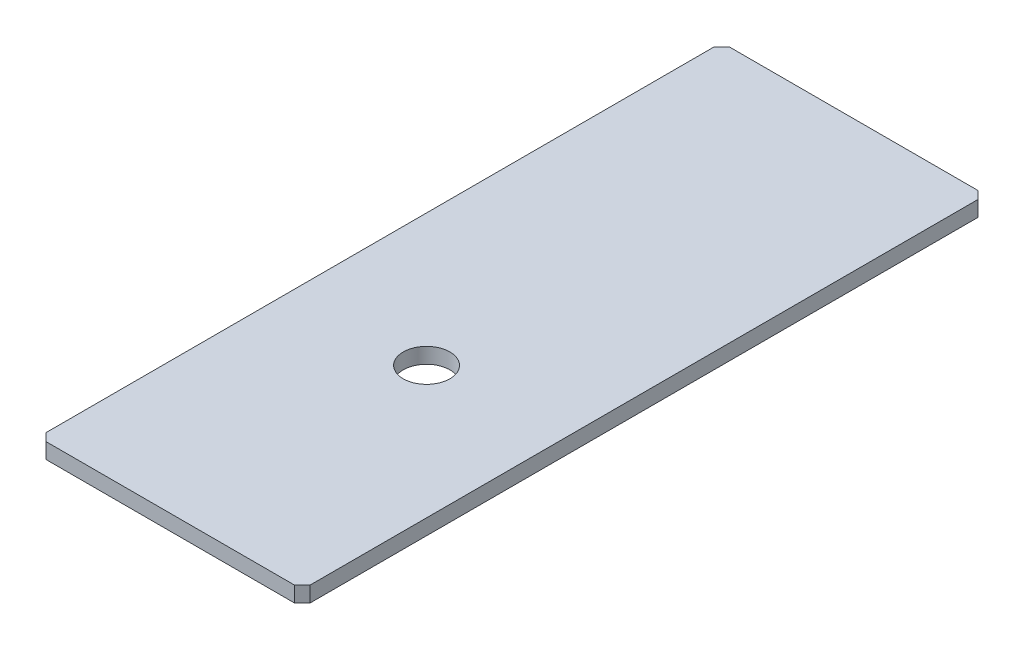
ISO-10303-21;
HEADER;
FILE_DESCRIPTION(('STEP AP214'),'2;1');
FILE_NAME('part.step','',(''),(''),'','','');
FILE_SCHEMA(('AUTOMOTIVE_DESIGN { 1 0 10303 214 1 1 1 1 }'));
ENDSEC;
DATA;
#1=APPLICATION_CONTEXT('core data for automotive mechanical design processes');
#2=APPLICATION_PROTOCOL_DEFINITION('international standard','automotive_design',2000,#1);
#3=PRODUCT_CONTEXT('',#1,'mechanical');
#4=PRODUCT('Part','Part','',(#3));
#5=PRODUCT_RELATED_PRODUCT_CATEGORY('part','',(#4));
#6=PRODUCT_DEFINITION_FORMATION('','',#4);
#7=PRODUCT_DEFINITION_CONTEXT('part definition',#1,'design');
#8=PRODUCT_DEFINITION('design','',#6,#7);
#9=PRODUCT_DEFINITION_SHAPE('','',#8);
#10=(LENGTH_UNIT() NAMED_UNIT(*) SI_UNIT(.MILLI.,.METRE.));
#11=(NAMED_UNIT(*) PLANE_ANGLE_UNIT() SI_UNIT($,.RADIAN.));
#12=(NAMED_UNIT(*) SI_UNIT($,.STERADIAN.) SOLID_ANGLE_UNIT());
#13=UNCERTAINTY_MEASURE_WITH_UNIT(LENGTH_MEASURE(1.E-05),#10,'distance_accuracy_value','');
#14=(GEOMETRIC_REPRESENTATION_CONTEXT(3) GLOBAL_UNCERTAINTY_ASSIGNED_CONTEXT((#13)) GLOBAL_UNIT_ASSIGNED_CONTEXT((#10,
#11,#12)) REPRESENTATION_CONTEXT('',''));
#15=CARTESIAN_POINT('',(0.,0.,0.));
#16=DIRECTION('',(0.,0.,1.));
#17=DIRECTION('',(1.,0.,0.));
#18=AXIS2_PLACEMENT_3D('',#15,#16,#17);
#19=CARTESIAN_POINT('',(0.,1.,0.));
#20=DIRECTION('',(0.,-1.,0.));
#21=DIRECTION('',(0.,0.,-1.));
#22=AXIS2_PLACEMENT_3D('',#19,#20,#21);
#23=PLANE('',#22);
#24=DIRECTION('',(-1.,0.,0.));
#25=VECTOR('',#24,1.);
#26=CARTESIAN_POINT('',(-8.,1.,-22.));
#27=LINE('',#26,#25);
#28=CARTESIAN_POINT('',(8.,1.,-22.));
#29=VERTEX_POINT('',#28);
#30=CARTESIAN_POINT('',(-8.,1.,-22.));
#31=VERTEX_POINT('',#30);
#32=EDGE_CURVE('E145',#29,#31,#27,.T.);
#33=ORIENTED_EDGE('',*,*,#32,.T.);
#34=DIRECTION('',(-0.707106781186547,0.,0.707106781186547));
#35=VECTOR('',#34,1.);
#36=CARTESIAN_POINT('',(-8.5,1.,-21.5));
#37=LINE('',#36,#35);
#38=CARTESIAN_POINT('',(-8.5,1.,-21.5));
#39=VERTEX_POINT('',#38);
#40=EDGE_CURVE('E93',#31,#39,#37,.T.);
#41=ORIENTED_EDGE('',*,*,#40,.T.);
#42=DIRECTION('',(0.,0.,1.));
#43=VECTOR('',#42,1.);
#44=CARTESIAN_POINT('',(-8.5,1.,-21.5));
#45=LINE('',#44,#43);
#46=CARTESIAN_POINT('',(-8.5,1.,21.5));
#47=VERTEX_POINT('',#46);
#48=EDGE_CURVE('E160',#39,#47,#45,.T.);
#49=ORIENTED_EDGE('',*,*,#48,.T.);
#50=DIRECTION('',(0.707106781186547,0.,0.707106781186547));
#51=VECTOR('',#50,1.);
#52=CARTESIAN_POINT('',(-8.5,1.,21.5));
#53=LINE('',#52,#51);
#54=CARTESIAN_POINT('',(-8.,1.,22.));
#55=VERTEX_POINT('',#54);
#56=EDGE_CURVE('E173',#47,#55,#53,.T.);
#57=ORIENTED_EDGE('',*,*,#56,.T.);
#58=DIRECTION('',(1.,0.,0.));
#59=VECTOR('',#58,1.);
#60=CARTESIAN_POINT('',(-8.,1.,22.));
#61=LINE('',#60,#59);
#62=CARTESIAN_POINT('',(8.,1.,22.));
#63=VERTEX_POINT('',#62);
#64=EDGE_CURVE('E112',#55,#63,#61,.T.);
#65=ORIENTED_EDGE('',*,*,#64,.T.);
#66=DIRECTION('',(0.707106781186547,0.,-0.707106781186547));
#67=VECTOR('',#66,1.);
#68=CARTESIAN_POINT('',(8.,1.,22.));
#69=LINE('',#68,#67);
#70=CARTESIAN_POINT('',(8.5,1.,21.5));
#71=VERTEX_POINT('',#70);
#72=EDGE_CURVE('E106',#63,#71,#69,.T.);
#73=ORIENTED_EDGE('',*,*,#72,.T.);
#74=DIRECTION('',(0.,0.,-1.));
#75=VECTOR('',#74,1.);
#76=CARTESIAN_POINT('',(8.5,1.,-21.5));
#77=LINE('',#76,#75);
#78=CARTESIAN_POINT('',(8.5,1.,-21.5));
#79=VERTEX_POINT('',#78);
#80=EDGE_CURVE('E110',#71,#79,#77,.T.);
#81=ORIENTED_EDGE('',*,*,#80,.T.);
#82=DIRECTION('',(-0.707106781186547,0.,-0.707106781186547));
#83=VECTOR('',#82,1.);
#84=CARTESIAN_POINT('',(8.,1.,-22.));
#85=LINE('',#84,#83);
#86=EDGE_CURVE('E50',#79,#29,#85,.T.);
#87=ORIENTED_EDGE('',*,*,#86,.T.);
#88=EDGE_LOOP('',(#33,#41,#49,#57,#65,#73,#81,#87));
#89=FACE_BOUND('',#88,.T.);
#90=CARTESIAN_POINT('',(0.,1.,5.49999999999999));
#91=DIRECTION('',(0.,1.,0.));
#92=DIRECTION('',(0.,0.,1.));
#93=AXIS2_PLACEMENT_3D('',#90,#91,#92);
#94=CIRCLE('',#93,1.5);
#95=CARTESIAN_POINT('',(0.,1.,6.99999999999999));
#96=VERTEX_POINT('',#95);
#97=EDGE_CURVE('E134',#96,#96,#94,.T.);
#98=ORIENTED_EDGE('',*,*,#97,.F.);
#99=EDGE_LOOP('',(#98));
#100=FACE_BOUND('',#99,.T.);
#101=ADVANCED_FACE('F33',(#89,#100),#23,.F.);
#102=CARTESIAN_POINT('',(0.,0.,0.));
#103=DIRECTION('',(0.,-1.,0.));
#104=DIRECTION('',(0.,0.,-1.));
#105=AXIS2_PLACEMENT_3D('',#102,#103,#104);
#106=PLANE('',#105);
#107=DIRECTION('',(-1.,0.,0.));
#108=VECTOR('',#107,1.);
#109=CARTESIAN_POINT('',(-8.,0.,-22.));
#110=LINE('',#109,#108);
#111=CARTESIAN_POINT('',(8.,0.,-22.));
#112=VERTEX_POINT('',#111);
#113=CARTESIAN_POINT('',(-8.,0.,-22.));
#114=VERTEX_POINT('',#113);
#115=EDGE_CURVE('E130',#112,#114,#110,.T.);
#116=ORIENTED_EDGE('',*,*,#115,.F.);
#117=DIRECTION('',(-0.707106781186547,0.,-0.707106781186547));
#118=VECTOR('',#117,1.);
#119=CARTESIAN_POINT('',(8.,0.,-22.));
#120=LINE('',#119,#118);
#121=CARTESIAN_POINT('',(8.5,0.,-21.5));
#122=VERTEX_POINT('',#121);
#123=EDGE_CURVE('E85',#122,#112,#120,.T.);
#124=ORIENTED_EDGE('',*,*,#123,.F.);
#125=DIRECTION('',(0.,0.,-1.));
#126=VECTOR('',#125,1.);
#127=CARTESIAN_POINT('',(8.5,0.,-21.5));
#128=LINE('',#127,#126);
#129=CARTESIAN_POINT('',(8.5,0.,21.5));
#130=VERTEX_POINT('',#129);
#131=EDGE_CURVE('E79',#130,#122,#128,.T.);
#132=ORIENTED_EDGE('',*,*,#131,.F.);
#133=DIRECTION('',(0.707106781186547,0.,-0.707106781186547));
#134=VECTOR('',#133,1.);
#135=CARTESIAN_POINT('',(8.,0.,22.));
#136=LINE('',#135,#134);
#137=CARTESIAN_POINT('',(8.,0.,22.));
#138=VERTEX_POINT('',#137);
#139=EDGE_CURVE('E120',#138,#130,#136,.T.);
#140=ORIENTED_EDGE('',*,*,#139,.F.);
#141=DIRECTION('',(1.,0.,0.));
#142=VECTOR('',#141,1.);
#143=CARTESIAN_POINT('',(-8.,0.,22.));
#144=LINE('',#143,#142);
#145=CARTESIAN_POINT('',(-8.,0.,22.));
#146=VERTEX_POINT('',#145);
#147=EDGE_CURVE('E140',#146,#138,#144,.T.);
#148=ORIENTED_EDGE('',*,*,#147,.F.);
#149=DIRECTION('',(0.707106781186547,0.,0.707106781186547));
#150=VECTOR('',#149,1.);
#151=CARTESIAN_POINT('',(-8.5,0.,21.5));
#152=LINE('',#151,#150);
#153=CARTESIAN_POINT('',(-8.5,0.,21.5));
#154=VERTEX_POINT('',#153);
#155=EDGE_CURVE('E138',#154,#146,#152,.T.);
#156=ORIENTED_EDGE('',*,*,#155,.F.);
#157=DIRECTION('',(0.,0.,1.));
#158=VECTOR('',#157,1.);
#159=CARTESIAN_POINT('',(-8.5,0.,-21.5));
#160=LINE('',#159,#158);
#161=CARTESIAN_POINT('',(-8.5,0.,-21.5));
#162=VERTEX_POINT('',#161);
#163=EDGE_CURVE('E136',#162,#154,#160,.T.);
#164=ORIENTED_EDGE('',*,*,#163,.F.);
#165=DIRECTION('',(-0.707106781186547,0.,0.707106781186547));
#166=VECTOR('',#165,1.);
#167=CARTESIAN_POINT('',(-8.5,0.,-21.5));
#168=LINE('',#167,#166);
#169=EDGE_CURVE('E133',#114,#162,#168,.T.);
#170=ORIENTED_EDGE('',*,*,#169,.F.);
#171=EDGE_LOOP('',(#116,#124,#132,#140,#148,#156,#164,#170));
#172=FACE_BOUND('',#171,.T.);
#173=CARTESIAN_POINT('',(0.,0.,5.49999999999999));
#174=DIRECTION('',(0.,1.,0.));
#175=DIRECTION('',(0.,0.,1.));
#176=AXIS2_PLACEMENT_3D('',#173,#174,#175);
#177=CIRCLE('',#176,1.5);
#178=CARTESIAN_POINT('',(0.,0.,6.99999999999999));
#179=VERTEX_POINT('',#178);
#180=EDGE_CURVE('E179',#179,#179,#177,.T.);
#181=ORIENTED_EDGE('',*,*,#180,.T.);
#182=EDGE_LOOP('',(#181));
#183=FACE_BOUND('',#182,.T.);
#184=ADVANCED_FACE('F164',(#172,#183),#106,.T.);
#185=CARTESIAN_POINT('',(-8.,1.,-22.));
#186=DIRECTION('',(0.,0.,1.));
#187=DIRECTION('',(1.,0.,0.));
#188=AXIS2_PLACEMENT_3D('',#185,#186,#187);
#189=PLANE('',#188);
#190=ORIENTED_EDGE('',*,*,#115,.T.);
#191=DIRECTION('',(0.,-1.,0.));
#192=VECTOR('',#191,1.);
#193=CARTESIAN_POINT('',(-8.,1.,-22.));
#194=LINE('',#193,#192);
#195=EDGE_CURVE('E11',#31,#114,#194,.T.);
#196=ORIENTED_EDGE('',*,*,#195,.F.);
#197=ORIENTED_EDGE('',*,*,#32,.F.);
#198=DIRECTION('',(0.,-1.,0.));
#199=VECTOR('',#198,1.);
#200=CARTESIAN_POINT('',(8.,1.,-22.));
#201=LINE('',#200,#199);
#202=EDGE_CURVE('E126',#29,#112,#201,.T.);
#203=ORIENTED_EDGE('',*,*,#202,.T.);
#204=EDGE_LOOP('',(#190,#196,#197,#203));
#205=FACE_BOUND('',#204,.T.);
#206=ADVANCED_FACE('F35',(#205),#189,.F.);
#207=CARTESIAN_POINT('',(-8.5,1.,-21.5));
#208=DIRECTION('',(0.707106781186547,0.,0.707106781186547));
#209=DIRECTION('',(0.707106781186548,0.,-0.707106781186548));
#210=AXIS2_PLACEMENT_3D('',#207,#208,#209);
#211=PLANE('',#210);
#212=ORIENTED_EDGE('',*,*,#169,.T.);
#213=DIRECTION('',(0.,-1.,0.));
#214=VECTOR('',#213,1.);
#215=CARTESIAN_POINT('',(-8.5,1.,-21.5));
#216=LINE('',#215,#214);
#217=EDGE_CURVE('E42',#39,#162,#216,.T.);
#218=ORIENTED_EDGE('',*,*,#217,.F.);
#219=ORIENTED_EDGE('',*,*,#40,.F.);
#220=ORIENTED_EDGE('',*,*,#195,.T.);
#221=EDGE_LOOP('',(#212,#218,#219,#220));
#222=FACE_BOUND('',#221,.T.);
#223=ADVANCED_FACE('F207',(#222),#211,.F.);
#224=CARTESIAN_POINT('',(-8.5,1.,-21.5));
#225=DIRECTION('',(1.,0.,0.));
#226=DIRECTION('',(0.,0.,-1.));
#227=AXIS2_PLACEMENT_3D('',#224,#225,#226);
#228=PLANE('',#227);
#229=ORIENTED_EDGE('',*,*,#163,.T.);
#230=DIRECTION('',(0.,-1.,0.));
#231=VECTOR('',#230,1.);
#232=CARTESIAN_POINT('',(-8.5,1.,21.5));
#233=LINE('',#232,#231);
#234=EDGE_CURVE('E152',#47,#154,#233,.T.);
#235=ORIENTED_EDGE('',*,*,#234,.F.);
#236=ORIENTED_EDGE('',*,*,#48,.F.);
#237=ORIENTED_EDGE('',*,*,#217,.T.);
#238=EDGE_LOOP('',(#229,#235,#236,#237));
#239=FACE_BOUND('',#238,.T.);
#240=ADVANCED_FACE('F158',(#239),#228,.F.);
#241=CARTESIAN_POINT('',(-8.5,1.,21.5));
#242=DIRECTION('',(0.707106781186547,0.,-0.707106781186547));
#243=DIRECTION('',(-0.707106781186548,0.,-0.707106781186548));
#244=AXIS2_PLACEMENT_3D('',#241,#242,#243);
#245=PLANE('',#244);
#246=ORIENTED_EDGE('',*,*,#155,.T.);
#247=DIRECTION('',(0.,-1.,0.));
#248=VECTOR('',#247,1.);
#249=CARTESIAN_POINT('',(-8.,1.,22.));
#250=LINE('',#249,#248);
#251=EDGE_CURVE('E149',#55,#146,#250,.T.);
#252=ORIENTED_EDGE('',*,*,#251,.F.);
#253=ORIENTED_EDGE('',*,*,#56,.F.);
#254=ORIENTED_EDGE('',*,*,#234,.T.);
#255=EDGE_LOOP('',(#246,#252,#253,#254));
#256=FACE_BOUND('',#255,.T.);
#257=ADVANCED_FACE('F169',(#256),#245,.F.);
#258=CARTESIAN_POINT('',(-8.,1.,22.));
#259=DIRECTION('',(0.,0.,-1.));
#260=DIRECTION('',(-1.,0.,0.));
#261=AXIS2_PLACEMENT_3D('',#258,#259,#260);
#262=PLANE('',#261);
#263=ORIENTED_EDGE('',*,*,#147,.T.);
#264=DIRECTION('',(0.,-1.,0.));
#265=VECTOR('',#264,1.);
#266=CARTESIAN_POINT('',(8.,1.,22.));
#267=LINE('',#266,#265);
#268=EDGE_CURVE('E121',#63,#138,#267,.T.);
#269=ORIENTED_EDGE('',*,*,#268,.F.);
#270=ORIENTED_EDGE('',*,*,#64,.F.);
#271=ORIENTED_EDGE('',*,*,#251,.T.);
#272=EDGE_LOOP('',(#263,#269,#270,#271));
#273=FACE_BOUND('',#272,.T.);
#274=ADVANCED_FACE('F172',(#273),#262,.F.);
#275=CARTESIAN_POINT('',(8.,1.,22.));
#276=DIRECTION('',(-0.707106781186547,0.,-0.707106781186547));
#277=DIRECTION('',(-0.707106781186548,0.,0.707106781186548));
#278=AXIS2_PLACEMENT_3D('',#275,#276,#277);
#279=PLANE('',#278);
#280=ORIENTED_EDGE('',*,*,#139,.T.);
#281=DIRECTION('',(0.,-1.,0.));
#282=VECTOR('',#281,1.);
#283=CARTESIAN_POINT('',(8.5,1.,21.5));
#284=LINE('',#283,#282);
#285=EDGE_CURVE('E117',#71,#130,#284,.T.);
#286=ORIENTED_EDGE('',*,*,#285,.F.);
#287=ORIENTED_EDGE('',*,*,#72,.F.);
#288=ORIENTED_EDGE('',*,*,#268,.T.);
#289=EDGE_LOOP('',(#280,#286,#287,#288));
#290=FACE_BOUND('',#289,.T.);
#291=ADVANCED_FACE('F118',(#290),#279,.F.);
#292=CARTESIAN_POINT('',(8.5,1.,-21.5));
#293=DIRECTION('',(-1.,0.,0.));
#294=DIRECTION('',(0.,0.,1.));
#295=AXIS2_PLACEMENT_3D('',#292,#293,#294);
#296=PLANE('',#295);
#297=ORIENTED_EDGE('',*,*,#131,.T.);
#298=DIRECTION('',(0.,-1.,0.));
#299=VECTOR('',#298,1.);
#300=CARTESIAN_POINT('',(8.5,1.,-21.5));
#301=LINE('',#300,#299);
#302=EDGE_CURVE('E122',#79,#122,#301,.T.);
#303=ORIENTED_EDGE('',*,*,#302,.F.);
#304=ORIENTED_EDGE('',*,*,#80,.F.);
#305=ORIENTED_EDGE('',*,*,#285,.T.);
#306=EDGE_LOOP('',(#297,#303,#304,#305));
#307=FACE_BOUND('',#306,.T.);
#308=ADVANCED_FACE('F124',(#307),#296,.F.);
#309=CARTESIAN_POINT('',(8.,1.,-22.));
#310=DIRECTION('',(-0.707106781186547,0.,0.707106781186547));
#311=DIRECTION('',(0.707106781186548,0.,0.707106781186548));
#312=AXIS2_PLACEMENT_3D('',#309,#310,#311);
#313=PLANE('',#312);
#314=ORIENTED_EDGE('',*,*,#123,.T.);
#315=ORIENTED_EDGE('',*,*,#202,.F.);
#316=ORIENTED_EDGE('',*,*,#86,.F.);
#317=ORIENTED_EDGE('',*,*,#302,.T.);
#318=EDGE_LOOP('',(#314,#315,#316,#317));
#319=FACE_BOUND('',#318,.T.);
#320=ADVANCED_FACE('F195',(#319),#313,.F.);
#321=CARTESIAN_POINT('',(0.,1.,5.49999999999999));
#322=DIRECTION('',(0.,-1.,0.));
#323=DIRECTION('',(0.,0.,-1.));
#324=AXIS2_PLACEMENT_3D('',#321,#322,#323);
#325=CYLINDRICAL_SURFACE('',#324,1.5);
#326=ORIENTED_EDGE('',*,*,#97,.T.);
#327=EDGE_LOOP('',(#326));
#328=FACE_BOUND('',#327,.T.);
#329=ORIENTED_EDGE('',*,*,#180,.F.);
#330=EDGE_LOOP('',(#329));
#331=FACE_BOUND('',#330,.T.);
#332=ADVANCED_FACE('F185',(#328,#331),#325,.F.);
#333=CLOSED_SHELL('',(#101,#184,#206,#223,#240,#257,#274,#291,#308,#320,#332));
#334=MANIFOLD_SOLID_BREP('B2',#333);
#335=ADVANCED_BREP_SHAPE_REPRESENTATION('',(#18,#334),#14);
#336=SHAPE_DEFINITION_REPRESENTATION(#9,#335);
ENDSEC;
END-ISO-10303-21;
